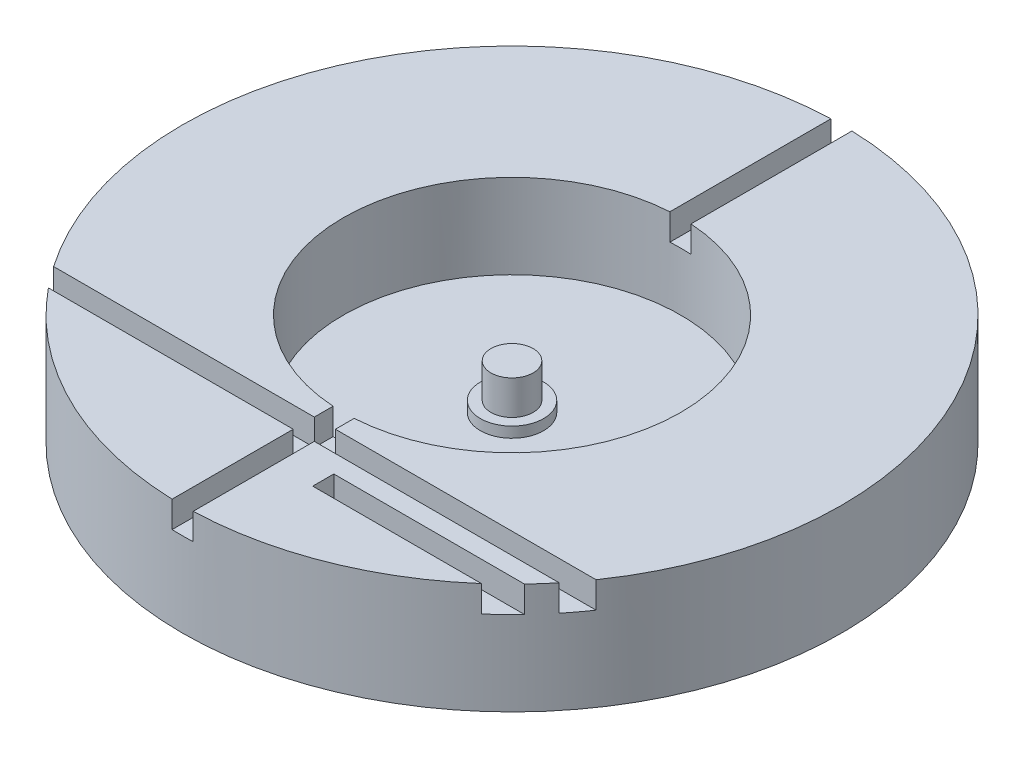
ISO-10303-21;
HEADER;
FILE_DESCRIPTION(('STEP AP214'),'2;1');
FILE_NAME('part.step','',(''),(''),'','','');
FILE_SCHEMA(('AUTOMOTIVE_DESIGN { 1 0 10303 214 1 1 1 1 }'));
ENDSEC;
DATA;
#1=APPLICATION_CONTEXT('core data for automotive mechanical design processes');
#2=APPLICATION_PROTOCOL_DEFINITION('international standard','automotive_design',2000,#1);
#3=PRODUCT_CONTEXT('',#1,'mechanical');
#4=PRODUCT('Part','Part','',(#3));
#5=PRODUCT_RELATED_PRODUCT_CATEGORY('part','',(#4));
#6=PRODUCT_DEFINITION_FORMATION('','',#4);
#7=PRODUCT_DEFINITION_CONTEXT('part definition',#1,'design');
#8=PRODUCT_DEFINITION('design','',#6,#7);
#9=PRODUCT_DEFINITION_SHAPE('','',#8);
#10=(LENGTH_UNIT() NAMED_UNIT(*) SI_UNIT(.MILLI.,.METRE.));
#11=(NAMED_UNIT(*) PLANE_ANGLE_UNIT() SI_UNIT($,.RADIAN.));
#12=(NAMED_UNIT(*) SI_UNIT($,.STERADIAN.) SOLID_ANGLE_UNIT());
#13=UNCERTAINTY_MEASURE_WITH_UNIT(LENGTH_MEASURE(1.E-05),#10,'distance_accuracy_value','');
#14=(GEOMETRIC_REPRESENTATION_CONTEXT(3) GLOBAL_UNCERTAINTY_ASSIGNED_CONTEXT((#13)) GLOBAL_UNIT_ASSIGNED_CONTEXT((#10,
#11,#12)) REPRESENTATION_CONTEXT('',''));
#15=CARTESIAN_POINT('',(0.,0.,0.));
#16=DIRECTION('',(0.,0.,1.));
#17=DIRECTION('',(1.,0.,0.));
#18=AXIS2_PLACEMENT_3D('',#15,#16,#17);
#19=CARTESIAN_POINT('',(0.,21.,0.));
#20=DIRECTION('',(0.,1.,0.));
#21=DIRECTION('',(0.,0.,1.));
#22=AXIS2_PLACEMENT_3D('',#19,#20,#21);
#23=PLANE('',#22);
#24=DIRECTION('',(1.,0.,0.));
#25=VECTOR('',#24,1.);
#26=CARTESIAN_POINT('',(0.,21.,47.));
#27=LINE('',#26,#25);
#28=CARTESIAN_POINT('',(9.19769411022903,21.,47.));
#29=VERTEX_POINT('',#28);
#30=CARTESIAN_POINT('',(41.197694110229,21.,47.));
#31=VERTEX_POINT('',#30);
#32=EDGE_CURVE('E387',#29,#31,#27,.T.);
#33=ORIENTED_EDGE('',*,*,#32,.F.);
#34=DIRECTION('',(0.,0.,1.));
#35=VECTOR('',#34,1.);
#36=CARTESIAN_POINT('',(9.19769411022903,21.,0.));
#37=LINE('',#36,#35);
#38=CARTESIAN_POINT('',(9.19769411022903,21.,43.));
#39=VERTEX_POINT('',#38);
#40=EDGE_CURVE('E384',#39,#29,#37,.T.);
#41=ORIENTED_EDGE('',*,*,#40,.F.);
#42=DIRECTION('',(1.,0.,0.));
#43=VECTOR('',#42,1.);
#44=CARTESIAN_POINT('',(0.,21.,43.));
#45=LINE('',#44,#43);
#46=CARTESIAN_POINT('',(45.3569178847064,21.,43.));
#47=VERTEX_POINT('',#46);
#48=EDGE_CURVE('E373',#39,#47,#45,.T.);
#49=ORIENTED_EDGE('',*,*,#48,.T.);
#50=CARTESIAN_POINT('',(0.,21.,0.));
#51=DIRECTION('',(0.,1.,0.));
#52=DIRECTION('',(0.,0.,1.));
#53=AXIS2_PLACEMENT_3D('',#50,#51,#52);
#54=CIRCLE('',#53,62.5);
#55=CARTESIAN_POINT('',(48.4355241532493,21.,39.5));
#56=VERTEX_POINT('',#55);
#57=EDGE_CURVE('E189',#47,#56,#54,.T.);
#58=ORIENTED_EDGE('',*,*,#57,.T.);
#59=DIRECTION('',(1.,0.,0.));
#60=VECTOR('',#59,1.);
#61=CARTESIAN_POINT('',(-48.4355241532493,21.,39.5));
#62=LINE('',#61,#60);
#63=CARTESIAN_POINT('',(2.,21.,39.5));
#64=VERTEX_POINT('',#63);
#65=EDGE_CURVE('E211',#64,#56,#62,.T.);
#66=ORIENTED_EDGE('',*,*,#65,.F.);
#67=DIRECTION('',(0.,0.,-1.));
#68=VECTOR('',#67,1.);
#69=CARTESIAN_POINT('',(2.,21.,-62.467991803803));
#70=LINE('',#69,#68);
#71=CARTESIAN_POINT('',(2.,21.,62.467991803803));
#72=VERTEX_POINT('',#71);
#73=EDGE_CURVE('E233',#72,#64,#70,.T.);
#74=ORIENTED_EDGE('',*,*,#73,.F.);
#75=EDGE_CURVE('E281',#72,#31,#54,.T.);
#76=ORIENTED_EDGE('',*,*,#75,.T.);
#77=EDGE_LOOP('',(#33,#41,#49,#58,#66,#74,#76));
#78=FACE_BOUND('',#77,.T.);
#79=ADVANCED_FACE('F32',(#78),#23,.T.);
#80=CARTESIAN_POINT('',(-48.4355241532493,21.,39.5));
#81=VERTEX_POINT('',#80);
#82=CARTESIAN_POINT('',(-2.,21.,39.5));
#83=VERTEX_POINT('',#82);
#84=EDGE_CURVE('E201',#81,#83,#62,.T.);
#85=ORIENTED_EDGE('',*,*,#84,.F.);
#86=CARTESIAN_POINT('',(-2.,21.,62.467991803803));
#87=VERTEX_POINT('',#86);
#88=EDGE_CURVE('E288',#81,#87,#54,.T.);
#89=ORIENTED_EDGE('',*,*,#88,.T.);
#90=DIRECTION('',(0.,0.,1.));
#91=VECTOR('',#90,1.);
#92=CARTESIAN_POINT('',(-2.,21.,-62.467991803803));
#93=LINE('',#92,#91);
#94=EDGE_CURVE('E228',#83,#87,#93,.T.);
#95=ORIENTED_EDGE('',*,*,#94,.F.);
#96=EDGE_LOOP('',(#85,#89,#95));
#97=FACE_BOUND('',#96,.T.);
#98=ADVANCED_FACE('F374',(#97),#23,.T.);
#99=CARTESIAN_POINT('',(-2.,16.,-62.467991803803));
#100=DIRECTION('',(-1.,0.,0.));
#101=DIRECTION('',(0.,0.,1.));
#102=AXIS2_PLACEMENT_3D('',#99,#100,#101);
#103=PLANE('',#102);
#104=DIRECTION('',(0.,0.,1.));
#105=VECTOR('',#104,1.);
#106=CARTESIAN_POINT('',(-2.,16.,-62.467991803803));
#107=LINE('',#106,#105);
#108=CARTESIAN_POINT('',(-2.,16.,39.5));
#109=VERTEX_POINT('',#108);
#110=CARTESIAN_POINT('',(-2.,16.,62.467991803803));
#111=VERTEX_POINT('',#110);
#112=EDGE_CURVE('E232',#109,#111,#107,.T.);
#113=ORIENTED_EDGE('',*,*,#112,.F.);
#114=DIRECTION('',(0.,1.,0.));
#115=VECTOR('',#114,1.);
#116=CARTESIAN_POINT('',(-2.,16.,39.5));
#117=LINE('',#116,#115);
#118=EDGE_CURVE('E225',#109,#83,#117,.T.);
#119=ORIENTED_EDGE('',*,*,#118,.T.);
#120=ORIENTED_EDGE('',*,*,#94,.T.);
#121=DIRECTION('',(0.,1.,0.));
#122=VECTOR('',#121,1.);
#123=CARTESIAN_POINT('',(-2.,16.,62.467991803803));
#124=LINE('',#123,#122);
#125=EDGE_CURVE('E258',#111,#87,#124,.T.);
#126=ORIENTED_EDGE('',*,*,#125,.F.);
#127=EDGE_LOOP('',(#113,#119,#120,#126));
#128=FACE_BOUND('',#127,.T.);
#129=ADVANCED_FACE('F353',(#128),#103,.F.);
#130=CARTESIAN_POINT('',(2.,16.,-62.467991803803));
#131=DIRECTION('',(1.,0.,0.));
#132=DIRECTION('',(0.,0.,-1.));
#133=AXIS2_PLACEMENT_3D('',#130,#131,#132);
#134=PLANE('',#133);
#135=ORIENTED_EDGE('',*,*,#73,.T.);
#136=DIRECTION('',(0.,-1.,0.));
#137=VECTOR('',#136,1.);
#138=CARTESIAN_POINT('',(2.,16.,39.5));
#139=LINE('',#138,#137);
#140=CARTESIAN_POINT('',(2.,16.,39.5));
#141=VERTEX_POINT('',#140);
#142=EDGE_CURVE('E11',#64,#141,#139,.T.);
#143=ORIENTED_EDGE('',*,*,#142,.T.);
#144=DIRECTION('',(0.,0.,-1.));
#145=VECTOR('',#144,1.);
#146=CARTESIAN_POINT('',(2.,16.,-62.467991803803));
#147=LINE('',#146,#145);
#148=CARTESIAN_POINT('',(2.,16.,62.467991803803));
#149=VERTEX_POINT('',#148);
#150=EDGE_CURVE('E240',#149,#141,#147,.T.);
#151=ORIENTED_EDGE('',*,*,#150,.F.);
#152=DIRECTION('',(0.,1.,0.));
#153=VECTOR('',#152,1.);
#154=CARTESIAN_POINT('',(2.,16.,62.467991803803));
#155=LINE('',#154,#153);
#156=EDGE_CURVE('E256',#149,#72,#155,.T.);
#157=ORIENTED_EDGE('',*,*,#156,.T.);
#158=EDGE_LOOP('',(#135,#143,#151,#157));
#159=FACE_BOUND('',#158,.T.);
#160=ADVANCED_FACE('F363',(#159),#134,.F.);
#161=DIRECTION('',(-1.,0.,0.));
#162=VECTOR('',#161,1.);
#163=CARTESIAN_POINT('',(-51.4392845984468,21.,35.5));
#164=LINE('',#163,#162);
#165=CARTESIAN_POINT('',(51.4392845984468,21.,35.5));
#166=VERTEX_POINT('',#165);
#167=CARTESIAN_POINT('',(2.,21.,35.5));
#168=VERTEX_POINT('',#167);
#169=EDGE_CURVE('E209',#166,#168,#164,.T.);
#170=ORIENTED_EDGE('',*,*,#169,.F.);
#171=CARTESIAN_POINT('',(2.,21.,-62.467991803803));
#172=VERTEX_POINT('',#171);
#173=EDGE_CURVE('E323',#166,#172,#54,.T.);
#174=ORIENTED_EDGE('',*,*,#173,.T.);
#175=CARTESIAN_POINT('',(2.,21.,-31.9374388453426));
#176=VERTEX_POINT('',#175);
#177=EDGE_CURVE('E247',#176,#172,#70,.T.);
#178=ORIENTED_EDGE('',*,*,#177,.F.);
#179=CARTESIAN_POINT('',(0.,21.,0.));
#180=DIRECTION('',(0.,1.,0.));
#181=DIRECTION('',(0.,0.,1.));
#182=AXIS2_PLACEMENT_3D('',#179,#180,#181);
#183=CIRCLE('',#182,32.);
#184=CARTESIAN_POINT('',(2.,21.,31.9374388453426));
#185=VERTEX_POINT('',#184);
#186=EDGE_CURVE('E278',#185,#176,#183,.T.);
#187=ORIENTED_EDGE('',*,*,#186,.F.);
#188=EDGE_CURVE('E251',#168,#185,#70,.T.);
#189=ORIENTED_EDGE('',*,*,#188,.F.);
#190=EDGE_LOOP('',(#170,#174,#178,#187,#189));
#191=FACE_BOUND('',#190,.T.);
#192=ADVANCED_FACE('F313',(#191),#23,.T.);
#193=CARTESIAN_POINT('',(0.,7.,0.));
#194=DIRECTION('',(0.,1.,0.));
#195=DIRECTION('',(0.,0.,1.));
#196=AXIS2_PLACEMENT_3D('',#193,#194,#195);
#197=CYLINDRICAL_SURFACE('',#196,4.);
#198=CARTESIAN_POINT('',(0.,7.,0.));
#199=DIRECTION('',(0.,1.,0.));
#200=DIRECTION('',(0.,0.,1.));
#201=AXIS2_PLACEMENT_3D('',#198,#199,#200);
#202=CIRCLE('',#201,4.);
#203=CARTESIAN_POINT('',(0.,7.,4.));
#204=VERTEX_POINT('',#203);
#205=EDGE_CURVE('E264',#204,#204,#202,.T.);
#206=CARTESIAN_POINT('',(0.,13.5,0.));
#207=DIRECTION('',(0.,1.,0.));
#208=DIRECTION('',(0.,0.,1.));
#209=AXIS2_PLACEMENT_3D('',#206,#207,#208);
#210=CIRCLE('',#209,4.);
#211=CARTESIAN_POINT('',(0.,13.5,4.));
#212=VERTEX_POINT('',#211);
#213=EDGE_CURVE('E255',#212,#212,#210,.T.);
#214=CARTESIAN_POINT('',(0.,7.,4.));
#215=CARTESIAN_POINT('',(0.,7.06770833333334,4.));
#216=CARTESIAN_POINT('',(0.,7.13541666666667,4.));
#217=CARTESIAN_POINT('',(0.,7.27083333333334,4.));
#218=CARTESIAN_POINT('',(0.,7.33854166666667,4.));
#219=CARTESIAN_POINT('',(0.,7.47395833333334,4.));
#220=CARTESIAN_POINT('',(0.,7.54166666666667,4.));
#221=CARTESIAN_POINT('',(0.,7.67708333333333,4.));
#222=CARTESIAN_POINT('',(0.,7.74479166666667,4.));
#223=CARTESIAN_POINT('',(0.,7.88020833333333,4.));
#224=CARTESIAN_POINT('',(0.,7.94791666666667,4.));
#225=CARTESIAN_POINT('',(0.,8.08333333333333,4.));
#226=CARTESIAN_POINT('',(0.,8.15104166666667,4.));
#227=CARTESIAN_POINT('',(0.,8.28645833333334,4.));
#228=CARTESIAN_POINT('',(0.,8.35416666666667,4.));
#229=CARTESIAN_POINT('',(0.,8.48958333333334,4.));
#230=CARTESIAN_POINT('',(0.,8.55729166666667,4.));
#231=CARTESIAN_POINT('',(0.,8.69270833333334,4.));
#232=CARTESIAN_POINT('',(0.,8.76041666666667,4.));
#233=CARTESIAN_POINT('',(0.,8.89583333333334,4.));
#234=CARTESIAN_POINT('',(0.,8.96354166666667,4.));
#235=CARTESIAN_POINT('',(0.,9.09895833333333,4.));
#236=CARTESIAN_POINT('',(0.,9.16666666666667,4.));
#237=CARTESIAN_POINT('',(0.,9.30208333333333,4.));
#238=CARTESIAN_POINT('',(0.,9.36979166666667,4.));
#239=CARTESIAN_POINT('',(0.,9.50520833333333,4.));
#240=CARTESIAN_POINT('',(0.,9.57291666666667,4.));
#241=CARTESIAN_POINT('',(0.,9.70833333333333,4.));
#242=CARTESIAN_POINT('',(0.,9.77604166666667,4.));
#243=CARTESIAN_POINT('',(0.,9.91145833333333,4.));
#244=CARTESIAN_POINT('',(0.,9.97916666666667,4.));
#245=CARTESIAN_POINT('',(0.,10.1145833333333,4.));
#246=CARTESIAN_POINT('',(0.,10.1822916666667,4.));
#247=CARTESIAN_POINT('',(0.,10.3177083333333,4.));
#248=CARTESIAN_POINT('',(0.,10.3854166666667,4.));
#249=CARTESIAN_POINT('',(0.,10.5208333333333,4.));
#250=CARTESIAN_POINT('',(0.,10.5885416666667,4.));
#251=CARTESIAN_POINT('',(0.,10.7239583333333,4.));
#252=CARTESIAN_POINT('',(0.,10.7916666666667,4.));
#253=CARTESIAN_POINT('',(0.,10.9270833333333,4.));
#254=CARTESIAN_POINT('',(0.,10.9947916666667,4.));
#255=CARTESIAN_POINT('',(0.,11.1302083333333,4.));
#256=CARTESIAN_POINT('',(0.,11.1979166666667,4.));
#257=CARTESIAN_POINT('',(0.,11.3333333333333,4.));
#258=CARTESIAN_POINT('',(0.,11.4010416666667,4.));
#259=CARTESIAN_POINT('',(0.,11.5364583333333,4.));
#260=CARTESIAN_POINT('',(0.,11.6041666666667,4.));
#261=CARTESIAN_POINT('',(0.,11.7395833333333,4.));
#262=CARTESIAN_POINT('',(0.,11.8072916666667,4.));
#263=CARTESIAN_POINT('',(0.,11.9427083333333,4.));
#264=CARTESIAN_POINT('',(0.,12.0104166666667,4.));
#265=CARTESIAN_POINT('',(0.,12.1458333333333,4.));
#266=CARTESIAN_POINT('',(0.,12.2135416666667,4.));
#267=CARTESIAN_POINT('',(0.,12.3489583333333,4.));
#268=CARTESIAN_POINT('',(0.,12.4166666666667,4.));
#269=CARTESIAN_POINT('',(0.,12.5520833333333,4.));
#270=CARTESIAN_POINT('',(0.,12.6197916666667,4.));
#271=CARTESIAN_POINT('',(0.,12.7552083333333,4.));
#272=CARTESIAN_POINT('',(0.,12.8229166666667,4.));
#273=CARTESIAN_POINT('',(0.,12.9583333333333,4.));
#274=CARTESIAN_POINT('',(0.,13.0260416666667,4.));
#275=CARTESIAN_POINT('',(0.,13.1614583333333,4.));
#276=CARTESIAN_POINT('',(0.,13.2291666666667,4.));
#277=CARTESIAN_POINT('',(0.,13.3645833333333,4.));
#278=CARTESIAN_POINT('',(0.,13.4322916666667,4.));
#279=CARTESIAN_POINT('',(0.,13.5,4.));
#280=B_SPLINE_CURVE_WITH_KNOTS('',3,(#214,#215,#216,#217,#218,#219,#220,#221,#222,#223,#224,
#225,#226,#227,#228,#229,#230,#231,#232,#233,#234,#235,#236,#237,#238,#239,#240,#241,#242,#243,
#244,#245,#246,#247,#248,#249,#250,#251,#252,#253,#254,#255,#256,#257,#258,#259,#260,#261,#262,
#263,#264,#265,#266,#267,#268,#269,#270,#271,#272,#273,#274,#275,#276,#277,#278,#279),
.UNSPECIFIED.,.F.,.F.,(4,2,2,2,2,2,2,2,2,2,2,2,2,2,2,2,2,2,2,2,2,2,2,2,2,2,2,2,2,2,2,2,4),(0.,
0.203124999999999,0.40625,0.609375,0.812499999999999,1.015625,1.21875,1.421875,1.625,1.828125,
2.03125,2.234375,2.4375,2.640625,2.84375,3.046875,3.25,3.453125,3.65625,3.859375,4.0625,
4.265625,4.46875,4.671875,4.875,5.078125,5.28125,5.484375,5.6875,5.890625,6.09375,6.296875,6.5),.UNSPECIFIED.);
#281=EDGE_CURVE('BSEAM419',#204,#212,#280,.T.);
#282=ORIENTED_EDGE('',*,*,#205,.T.);
#283=ORIENTED_EDGE('',*,*,#213,.F.);
#284=ORIENTED_EDGE('',*,*,#281,.T.);
#285=ORIENTED_EDGE('',*,*,#281,.F.);
#286=EDGE_LOOP('',(#282,#284,#283,#285));
#287=FACE_BOUND('',#286,.T.);
#288=ADVANCED_FACE('F419',(#287),#197,.T.);
#289=CARTESIAN_POINT('',(0.,5.,0.));
#290=DIRECTION('',(0.,1.,0.));
#291=DIRECTION('',(0.,0.,1.));
#292=AXIS2_PLACEMENT_3D('',#289,#290,#291);
#293=CYLINDRICAL_SURFACE('',#292,6.);
#294=CARTESIAN_POINT('',(0.,5.,0.));
#295=DIRECTION('',(0.,1.,0.));
#296=DIRECTION('',(0.,0.,1.));
#297=AXIS2_PLACEMENT_3D('',#294,#295,#296);
#298=CIRCLE('',#297,6.);
#299=CARTESIAN_POINT('',(0.,5.,6.));
#300=VERTEX_POINT('',#299);
#301=EDGE_CURVE('E270',#300,#300,#298,.T.);
#302=ORIENTED_EDGE('',*,*,#301,.T.);
#303=EDGE_LOOP('',(#302));
#304=FACE_BOUND('',#303,.T.);
#305=CARTESIAN_POINT('',(0.,7.,0.));
#306=DIRECTION('',(0.,1.,0.));
#307=DIRECTION('',(0.,0.,1.));
#308=AXIS2_PLACEMENT_3D('',#305,#306,#307);
#309=CIRCLE('',#308,6.);
#310=CARTESIAN_POINT('',(0.,7.,6.));
#311=VERTEX_POINT('',#310);
#312=EDGE_CURVE('E267',#311,#311,#309,.T.);
#313=ORIENTED_EDGE('',*,*,#312,.F.);
#314=EDGE_LOOP('',(#313));
#315=FACE_BOUND('',#314,.T.);
#316=ADVANCED_FACE('F417',(#304,#315),#293,.T.);
#317=CARTESIAN_POINT('',(0.,21.,0.));
#318=DIRECTION('',(0.,-1.,0.));
#319=DIRECTION('',(0.,0.,-1.));
#320=AXIS2_PLACEMENT_3D('',#317,#318,#319);
#321=CYLINDRICAL_SURFACE('',#320,62.5);
#322=CARTESIAN_POINT('',(0.,16.,0.));
#323=DIRECTION('',(0.,1.,0.));
#324=DIRECTION('',(0.,0.,1.));
#325=AXIS2_PLACEMENT_3D('',#322,#323,#324);
#326=CIRCLE('',#325,62.5);
#327=CARTESIAN_POINT('',(41.197694110229,16.,47.));
#328=VERTEX_POINT('',#327);
#329=CARTESIAN_POINT('',(45.3569178847064,16.,43.));
#330=VERTEX_POINT('',#329);
#331=EDGE_CURVE('E179',#328,#330,#326,.T.);
#332=ORIENTED_EDGE('',*,*,#331,.F.);
#333=DIRECTION('',(0.,1.,0.));
#334=VECTOR('',#333,1.);
#335=CARTESIAN_POINT('',(41.197694110229,16.,47.));
#336=LINE('',#335,#334);
#337=EDGE_CURVE('E190',#328,#31,#336,.T.);
#338=ORIENTED_EDGE('',*,*,#337,.T.);
#339=ORIENTED_EDGE('',*,*,#75,.F.);
#340=ORIENTED_EDGE('',*,*,#156,.F.);
#341=CARTESIAN_POINT('',(0.,16.,0.));
#342=DIRECTION('',(0.,1.,0.));
#343=DIRECTION('',(0.,0.,1.));
#344=AXIS2_PLACEMENT_3D('',#341,#342,#343);
#345=CIRCLE('',#344,62.5);
#346=EDGE_CURVE('E236',#111,#149,#345,.T.);
#347=ORIENTED_EDGE('',*,*,#346,.F.);
#348=ORIENTED_EDGE('',*,*,#125,.T.);
#349=ORIENTED_EDGE('',*,*,#88,.F.);
#350=DIRECTION('',(0.,1.,0.));
#351=VECTOR('',#350,1.);
#352=CARTESIAN_POINT('',(-48.4355241532493,16.,39.5));
#353=LINE('',#352,#351);
#354=CARTESIAN_POINT('',(-48.4355241532493,16.,39.5));
#355=VERTEX_POINT('',#354);
#356=EDGE_CURVE('E217',#355,#81,#353,.T.);
#357=ORIENTED_EDGE('',*,*,#356,.F.);
#358=CARTESIAN_POINT('',(0.,16.,0.));
#359=DIRECTION('',(0.,1.,0.));
#360=DIRECTION('',(0.,0.,1.));
#361=AXIS2_PLACEMENT_3D('',#358,#359,#360);
#362=CIRCLE('',#361,62.5);
#363=CARTESIAN_POINT('',(-51.4392845984468,16.,35.5));
#364=VERTEX_POINT('',#363);
#365=EDGE_CURVE('E204',#364,#355,#362,.T.);
#366=ORIENTED_EDGE('',*,*,#365,.F.);
#367=DIRECTION('',(0.,1.,0.));
#368=VECTOR('',#367,1.);
#369=CARTESIAN_POINT('',(-51.4392845984468,16.,35.5));
#370=LINE('',#369,#368);
#371=CARTESIAN_POINT('',(-51.4392845984468,21.,35.5));
#372=VERTEX_POINT('',#371);
#373=EDGE_CURVE('E219',#364,#372,#370,.T.);
#374=ORIENTED_EDGE('',*,*,#373,.T.);
#375=CARTESIAN_POINT('',(-2.,21.,-62.467991803803));
#376=VERTEX_POINT('',#375);
#377=EDGE_CURVE('E285',#376,#372,#54,.T.);
#378=ORIENTED_EDGE('',*,*,#377,.F.);
#379=DIRECTION('',(0.,1.,0.));
#380=VECTOR('',#379,1.);
#381=CARTESIAN_POINT('',(-2.,16.,-62.467991803803));
#382=LINE('',#381,#380);
#383=CARTESIAN_POINT('',(-2.,16.,-62.467991803803));
#384=VERTEX_POINT('',#383);
#385=EDGE_CURVE('E243',#384,#376,#382,.T.);
#386=ORIENTED_EDGE('',*,*,#385,.F.);
#387=CARTESIAN_POINT('',(0.,16.,0.));
#388=DIRECTION('',(0.,1.,0.));
#389=DIRECTION('',(0.,0.,1.));
#390=AXIS2_PLACEMENT_3D('',#387,#388,#389);
#391=CIRCLE('',#390,62.5);
#392=CARTESIAN_POINT('',(2.,16.,-62.467991803803));
#393=VERTEX_POINT('',#392);
#394=EDGE_CURVE('E229',#393,#384,#391,.T.);
#395=ORIENTED_EDGE('',*,*,#394,.F.);
#396=DIRECTION('',(0.,1.,0.));
#397=VECTOR('',#396,1.);
#398=CARTESIAN_POINT('',(2.,16.,-62.467991803803));
#399=LINE('',#398,#397);
#400=EDGE_CURVE('E252',#393,#172,#399,.T.);
#401=ORIENTED_EDGE('',*,*,#400,.T.);
#402=ORIENTED_EDGE('',*,*,#173,.F.);
#403=DIRECTION('',(0.,1.,0.));
#404=VECTOR('',#403,1.);
#405=CARTESIAN_POINT('',(51.4392845984468,16.,35.5));
#406=LINE('',#405,#404);
#407=CARTESIAN_POINT('',(51.4392845984468,16.,35.5));
#408=VERTEX_POINT('',#407);
#409=EDGE_CURVE('E208',#408,#166,#406,.T.);
#410=ORIENTED_EDGE('',*,*,#409,.F.);
#411=CARTESIAN_POINT('',(0.,16.,0.));
#412=DIRECTION('',(0.,1.,0.));
#413=DIRECTION('',(0.,0.,1.));
#414=AXIS2_PLACEMENT_3D('',#411,#412,#413);
#415=CIRCLE('',#414,62.5);
#416=CARTESIAN_POINT('',(48.4355241532493,16.,39.5));
#417=VERTEX_POINT('',#416);
#418=EDGE_CURVE('E197',#417,#408,#415,.T.);
#419=ORIENTED_EDGE('',*,*,#418,.F.);
#420=DIRECTION('',(0.,1.,0.));
#421=VECTOR('',#420,1.);
#422=CARTESIAN_POINT('',(48.4355241532493,16.,39.5));
#423=LINE('',#422,#421);
#424=EDGE_CURVE('E214',#417,#56,#423,.T.);
#425=ORIENTED_EDGE('',*,*,#424,.T.);
#426=ORIENTED_EDGE('',*,*,#57,.F.);
#427=DIRECTION('',(0.,1.,0.));
#428=VECTOR('',#427,1.);
#429=CARTESIAN_POINT('',(45.3569178847064,16.,43.));
#430=LINE('',#429,#428);
#431=EDGE_CURVE('E174',#330,#47,#430,.T.);
#432=ORIENTED_EDGE('',*,*,#431,.F.);
#433=EDGE_LOOP('',(#332,#338,#339,#340,#347,#348,#349,#357,#366,#374,#378,#386,#395,#401,#402,
#410,#419,#425,#426,#432));
#434=FACE_BOUND('',#433,.T.);
#435=CARTESIAN_POINT('',(0.,0.,0.));
#436=DIRECTION('',(0.,1.,0.));
#437=DIRECTION('',(0.,0.,1.));
#438=AXIS2_PLACEMENT_3D('',#435,#436,#437);
#439=CIRCLE('',#438,62.5);
#440=CARTESIAN_POINT('',(0.,0.,62.5));
#441=VERTEX_POINT('',#440);
#442=EDGE_CURVE('E277',#441,#441,#439,.T.);
#443=ORIENTED_EDGE('',*,*,#442,.T.);
#444=EDGE_LOOP('',(#443));
#445=FACE_BOUND('',#444,.T.);
#446=ADVANCED_FACE('F34',(#434,#445),#321,.T.);
#447=CARTESIAN_POINT('',(-2.,21.,35.5));
#448=VERTEX_POINT('',#447);
#449=EDGE_CURVE('E212',#448,#372,#164,.T.);
#450=ORIENTED_EDGE('',*,*,#449,.F.);
#451=CARTESIAN_POINT('',(-2.,21.,31.9374388453426));
#452=VERTEX_POINT('',#451);
#453=EDGE_CURVE('E248',#452,#448,#93,.T.);
#454=ORIENTED_EDGE('',*,*,#453,.F.);
#455=CARTESIAN_POINT('',(-2.,21.,-31.9374388453426));
#456=VERTEX_POINT('',#455);
#457=EDGE_CURVE('E273',#456,#452,#183,.T.);
#458=ORIENTED_EDGE('',*,*,#457,.F.);
#459=EDGE_CURVE('E245',#376,#456,#93,.T.);
#460=ORIENTED_EDGE('',*,*,#459,.F.);
#461=ORIENTED_EDGE('',*,*,#377,.T.);
#462=EDGE_LOOP('',(#450,#454,#458,#460,#461));
#463=FACE_BOUND('',#462,.T.);
#464=ADVANCED_FACE('F345',(#463),#23,.T.);
#465=CARTESIAN_POINT('',(0.,0.,0.));
#466=DIRECTION('',(0.,1.,0.));
#467=DIRECTION('',(0.,0.,1.));
#468=AXIS2_PLACEMENT_3D('',#465,#466,#467);
#469=PLANE('',#468);
#470=ORIENTED_EDGE('',*,*,#442,.F.);
#471=EDGE_LOOP('',(#470));
#472=FACE_BOUND('',#471,.T.);
#473=ADVANCED_FACE('F411',(#472),#469,.F.);
#474=CARTESIAN_POINT('',(0.,5.,0.));
#475=DIRECTION('',(0.,1.,0.));
#476=DIRECTION('',(0.,0.,1.));
#477=AXIS2_PLACEMENT_3D('',#474,#475,#476);
#478=CYLINDRICAL_SURFACE('',#477,32.);
#479=ORIENTED_EDGE('',*,*,#186,.T.);
#480=DIRECTION('',(0.,1.,0.));
#481=VECTOR('',#480,1.);
#482=CARTESIAN_POINT('',(2.,5.,-31.9374388453426));
#483=LINE('',#482,#481);
#484=CARTESIAN_POINT('',(2.,16.,-31.9374388453426));
#485=VERTEX_POINT('',#484);
#486=EDGE_CURVE('E300',#176,#485,#483,.F.);
#487=ORIENTED_EDGE('',*,*,#486,.T.);
#488=CARTESIAN_POINT('',(0.,16.,0.));
#489=DIRECTION('',(0.,1.,0.));
#490=DIRECTION('',(0.,0.,1.));
#491=AXIS2_PLACEMENT_3D('',#488,#489,#490);
#492=CIRCLE('',#491,32.);
#493=CARTESIAN_POINT('',(-2.,16.,-31.9374388453426));
#494=VERTEX_POINT('',#493);
#495=EDGE_CURVE('E291',#494,#485,#492,.F.);
#496=ORIENTED_EDGE('',*,*,#495,.F.);
#497=DIRECTION('',(0.,1.,0.));
#498=VECTOR('',#497,1.);
#499=CARTESIAN_POINT('',(-2.,5.,-31.9374388453426));
#500=LINE('',#499,#498);
#501=EDGE_CURVE('E297',#494,#456,#500,.T.);
#502=ORIENTED_EDGE('',*,*,#501,.T.);
#503=ORIENTED_EDGE('',*,*,#457,.T.);
#504=DIRECTION('',(0.,1.,0.));
#505=VECTOR('',#504,1.);
#506=CARTESIAN_POINT('',(-2.,5.,31.9374388453426));
#507=LINE('',#506,#505);
#508=CARTESIAN_POINT('',(-2.,16.,31.9374388453426));
#509=VERTEX_POINT('',#508);
#510=EDGE_CURVE('E290',#452,#509,#507,.F.);
#511=ORIENTED_EDGE('',*,*,#510,.T.);
#512=CARTESIAN_POINT('',(2.,16.,31.9374388453426));
#513=VERTEX_POINT('',#512);
#514=EDGE_CURVE('E284',#513,#509,#492,.F.);
#515=ORIENTED_EDGE('',*,*,#514,.F.);
#516=DIRECTION('',(0.,1.,0.));
#517=VECTOR('',#516,1.);
#518=CARTESIAN_POINT('',(2.,5.,31.9374388453426));
#519=LINE('',#518,#517);
#520=EDGE_CURVE('E294',#513,#185,#519,.T.);
#521=ORIENTED_EDGE('',*,*,#520,.T.);
#522=EDGE_LOOP('',(#479,#487,#496,#502,#503,#511,#515,#521));
#523=FACE_BOUND('',#522,.T.);
#524=CARTESIAN_POINT('',(0.,5.,0.));
#525=DIRECTION('',(0.,1.,0.));
#526=DIRECTION('',(0.,0.,1.));
#527=AXIS2_PLACEMENT_3D('',#524,#525,#526);
#528=CIRCLE('',#527,32.);
#529=CARTESIAN_POINT('',(0.,5.,32.));
#530=VERTEX_POINT('',#529);
#531=EDGE_CURVE('E274',#530,#530,#528,.T.);
#532=ORIENTED_EDGE('',*,*,#531,.F.);
#533=EDGE_LOOP('',(#532));
#534=FACE_BOUND('',#533,.T.);
#535=ADVANCED_FACE('F335',(#523,#534),#478,.F.);
#536=CARTESIAN_POINT('',(0.,5.,0.));
#537=DIRECTION('',(0.,1.,0.));
#538=DIRECTION('',(0.,0.,1.));
#539=AXIS2_PLACEMENT_3D('',#536,#537,#538);
#540=PLANE('',#539);
#541=ORIENTED_EDGE('',*,*,#301,.F.);
#542=EDGE_LOOP('',(#541));
#543=FACE_BOUND('',#542,.T.);
#544=ORIENTED_EDGE('',*,*,#531,.T.);
#545=EDGE_LOOP('',(#544));
#546=FACE_BOUND('',#545,.T.);
#547=ADVANCED_FACE('F527',(#543,#546),#540,.T.);
#548=CARTESIAN_POINT('',(0.,7.,0.));
#549=DIRECTION('',(0.,1.,0.));
#550=DIRECTION('',(0.,0.,1.));
#551=AXIS2_PLACEMENT_3D('',#548,#549,#550);
#552=PLANE('',#551);
#553=ORIENTED_EDGE('',*,*,#205,.F.);
#554=EDGE_LOOP('',(#553));
#555=FACE_BOUND('',#554,.T.);
#556=ORIENTED_EDGE('',*,*,#312,.T.);
#557=EDGE_LOOP('',(#556));
#558=FACE_BOUND('',#557,.T.);
#559=ADVANCED_FACE('F451',(#555,#558),#552,.T.);
#560=CARTESIAN_POINT('',(0.,13.5,0.));
#561=DIRECTION('',(0.,1.,0.));
#562=DIRECTION('',(0.,0.,1.));
#563=AXIS2_PLACEMENT_3D('',#560,#561,#562);
#564=PLANE('',#563);
#565=ORIENTED_EDGE('',*,*,#213,.T.);
#566=EDGE_LOOP('',(#565));
#567=FACE_BOUND('',#566,.T.);
#568=ADVANCED_FACE('F447',(#567),#564,.T.);
#569=CARTESIAN_POINT('',(0.,16.,0.));
#570=DIRECTION('',(0.,1.,0.));
#571=DIRECTION('',(0.,0.,1.));
#572=AXIS2_PLACEMENT_3D('',#569,#570,#571);
#573=PLANE('',#572);
#574=CARTESIAN_POINT('',(-2.,16.,35.5));
#575=VERTEX_POINT('',#574);
#576=EDGE_CURVE('E237',#509,#575,#107,.T.);
#577=ORIENTED_EDGE('',*,*,#576,.T.);
#578=DIRECTION('',(-1.,0.,0.));
#579=VECTOR('',#578,1.);
#580=CARTESIAN_POINT('',(-51.4392845984468,16.,35.5));
#581=LINE('',#580,#579);
#582=EDGE_CURVE('E200',#575,#364,#581,.T.);
#583=ORIENTED_EDGE('',*,*,#582,.T.);
#584=ORIENTED_EDGE('',*,*,#365,.T.);
#585=DIRECTION('',(1.,0.,0.));
#586=VECTOR('',#585,1.);
#587=CARTESIAN_POINT('',(-48.4355241532493,16.,39.5));
#588=LINE('',#587,#586);
#589=EDGE_CURVE('E55',#355,#109,#588,.T.);
#590=ORIENTED_EDGE('',*,*,#589,.T.);
#591=ORIENTED_EDGE('',*,*,#112,.T.);
#592=ORIENTED_EDGE('',*,*,#346,.T.);
#593=ORIENTED_EDGE('',*,*,#150,.T.);
#594=EDGE_CURVE('E206',#141,#417,#588,.T.);
#595=ORIENTED_EDGE('',*,*,#594,.T.);
#596=ORIENTED_EDGE('',*,*,#418,.T.);
#597=CARTESIAN_POINT('',(2.,16.,35.5));
#598=VERTEX_POINT('',#597);
#599=EDGE_CURVE('E202',#408,#598,#581,.T.);
#600=ORIENTED_EDGE('',*,*,#599,.T.);
#601=EDGE_CURVE('E244',#598,#513,#147,.T.);
#602=ORIENTED_EDGE('',*,*,#601,.T.);
#603=ORIENTED_EDGE('',*,*,#514,.T.);
#604=EDGE_LOOP('',(#577,#583,#584,#590,#591,#592,#593,#595,#596,#600,#602,#603));
#605=FACE_BOUND('',#604,.T.);
#606=ADVANCED_FACE('F331',(#605),#573,.T.);
#607=ORIENTED_EDGE('',*,*,#453,.T.);
#608=DIRECTION('',(0.,-1.,0.));
#609=VECTOR('',#608,1.);
#610=CARTESIAN_POINT('',(-2.,16.,35.5));
#611=LINE('',#610,#609);
#612=EDGE_CURVE('E216',#448,#575,#611,.T.);
#613=ORIENTED_EDGE('',*,*,#612,.T.);
#614=ORIENTED_EDGE('',*,*,#576,.F.);
#615=ORIENTED_EDGE('',*,*,#510,.F.);
#616=EDGE_LOOP('',(#607,#613,#614,#615));
#617=FACE_BOUND('',#616,.T.);
#618=ADVANCED_FACE('F342',(#617),#103,.F.);
#619=ORIENTED_EDGE('',*,*,#601,.F.);
#620=DIRECTION('',(0.,1.,0.));
#621=VECTOR('',#620,1.);
#622=CARTESIAN_POINT('',(2.,16.,35.5));
#623=LINE('',#622,#621);
#624=EDGE_CURVE('E40',#598,#168,#623,.T.);
#625=ORIENTED_EDGE('',*,*,#624,.T.);
#626=ORIENTED_EDGE('',*,*,#188,.T.);
#627=ORIENTED_EDGE('',*,*,#520,.F.);
#628=EDGE_LOOP('',(#619,#625,#626,#627));
#629=FACE_BOUND('',#628,.T.);
#630=ADVANCED_FACE('F307',(#629),#134,.F.);
#631=ORIENTED_EDGE('',*,*,#177,.T.);
#632=ORIENTED_EDGE('',*,*,#400,.F.);
#633=EDGE_CURVE('E239',#485,#393,#147,.T.);
#634=ORIENTED_EDGE('',*,*,#633,.F.);
#635=ORIENTED_EDGE('',*,*,#486,.F.);
#636=EDGE_LOOP('',(#631,#632,#634,#635));
#637=FACE_BOUND('',#636,.T.);
#638=ADVANCED_FACE('F319',(#637),#134,.F.);
#639=EDGE_CURVE('E234',#384,#494,#107,.T.);
#640=ORIENTED_EDGE('',*,*,#639,.F.);
#641=ORIENTED_EDGE('',*,*,#385,.T.);
#642=ORIENTED_EDGE('',*,*,#459,.T.);
#643=ORIENTED_EDGE('',*,*,#501,.F.);
#644=EDGE_LOOP('',(#640,#641,#642,#643));
#645=FACE_BOUND('',#644,.T.);
#646=ADVANCED_FACE('F431',(#645),#103,.F.);
#647=ORIENTED_EDGE('',*,*,#495,.T.);
#648=ORIENTED_EDGE('',*,*,#633,.T.);
#649=ORIENTED_EDGE('',*,*,#394,.T.);
#650=ORIENTED_EDGE('',*,*,#639,.T.);
#651=EDGE_LOOP('',(#647,#648,#649,#650));
#652=FACE_BOUND('',#651,.T.);
#653=ADVANCED_FACE('F327',(#652),#573,.T.);
#654=CARTESIAN_POINT('',(-51.4392845984468,16.,35.5));
#655=DIRECTION('',(0.,0.,-1.));
#656=DIRECTION('',(-1.,0.,0.));
#657=AXIS2_PLACEMENT_3D('',#654,#655,#656);
#658=PLANE('',#657);
#659=ORIENTED_EDGE('',*,*,#599,.F.);
#660=ORIENTED_EDGE('',*,*,#409,.T.);
#661=ORIENTED_EDGE('',*,*,#169,.T.);
#662=ORIENTED_EDGE('',*,*,#624,.F.);
#663=EDGE_LOOP('',(#659,#660,#661,#662));
#664=FACE_BOUND('',#663,.T.);
#665=ADVANCED_FACE('F401',(#664),#658,.F.);
#666=CARTESIAN_POINT('',(-48.4355241532493,16.,39.5));
#667=DIRECTION('',(0.,0.,1.));
#668=DIRECTION('',(1.,0.,0.));
#669=AXIS2_PLACEMENT_3D('',#666,#667,#668);
#670=PLANE('',#669);
#671=ORIENTED_EDGE('',*,*,#65,.T.);
#672=ORIENTED_EDGE('',*,*,#424,.F.);
#673=ORIENTED_EDGE('',*,*,#594,.F.);
#674=ORIENTED_EDGE('',*,*,#142,.F.);
#675=EDGE_LOOP('',(#671,#672,#673,#674));
#676=FACE_BOUND('',#675,.T.);
#677=ADVANCED_FACE('F368',(#676),#670,.F.);
#678=ORIENTED_EDGE('',*,*,#589,.F.);
#679=ORIENTED_EDGE('',*,*,#356,.T.);
#680=ORIENTED_EDGE('',*,*,#84,.T.);
#681=ORIENTED_EDGE('',*,*,#118,.F.);
#682=EDGE_LOOP('',(#678,#679,#680,#681));
#683=FACE_BOUND('',#682,.T.);
#684=ADVANCED_FACE('F376',(#683),#670,.F.);
#685=ORIENTED_EDGE('',*,*,#449,.T.);
#686=ORIENTED_EDGE('',*,*,#373,.F.);
#687=ORIENTED_EDGE('',*,*,#582,.F.);
#688=ORIENTED_EDGE('',*,*,#612,.F.);
#689=EDGE_LOOP('',(#685,#686,#687,#688));
#690=FACE_BOUND('',#689,.T.);
#691=ADVANCED_FACE('F380',(#690),#658,.F.);
#692=CARTESIAN_POINT('',(0.,16.,47.));
#693=DIRECTION('',(0.,0.,1.));
#694=DIRECTION('',(1.,0.,0.));
#695=AXIS2_PLACEMENT_3D('',#692,#693,#694);
#696=PLANE('',#695);
#697=ORIENTED_EDGE('',*,*,#32,.T.);
#698=ORIENTED_EDGE('',*,*,#337,.F.);
#699=DIRECTION('',(1.,0.,0.));
#700=VECTOR('',#699,1.);
#701=CARTESIAN_POINT('',(0.,16.,47.));
#702=LINE('',#701,#700);
#703=CARTESIAN_POINT('',(9.19769411022903,16.,47.));
#704=VERTEX_POINT('',#703);
#705=EDGE_CURVE('E47',#704,#328,#702,.T.);
#706=ORIENTED_EDGE('',*,*,#705,.F.);
#707=DIRECTION('',(0.,1.,0.));
#708=VECTOR('',#707,1.);
#709=CARTESIAN_POINT('',(9.19769411022903,16.,47.));
#710=LINE('',#709,#708);
#711=EDGE_CURVE('E192',#704,#29,#710,.T.);
#712=ORIENTED_EDGE('',*,*,#711,.T.);
#713=EDGE_LOOP('',(#697,#698,#706,#712));
#714=FACE_BOUND('',#713,.T.);
#715=ADVANCED_FACE('F392',(#714),#696,.F.);
#716=CARTESIAN_POINT('',(9.19769411022903,16.,0.));
#717=DIRECTION('',(-1.,0.,0.));
#718=DIRECTION('',(0.,0.,1.));
#719=AXIS2_PLACEMENT_3D('',#716,#717,#718);
#720=PLANE('',#719);
#721=ORIENTED_EDGE('',*,*,#40,.T.);
#722=ORIENTED_EDGE('',*,*,#711,.F.);
#723=DIRECTION('',(0.,0.,1.));
#724=VECTOR('',#723,1.);
#725=CARTESIAN_POINT('',(9.19769411022903,16.,0.));
#726=LINE('',#725,#724);
#727=CARTESIAN_POINT('',(9.19769411022903,16.,43.));
#728=VERTEX_POINT('',#727);
#729=EDGE_CURVE('E178',#728,#704,#726,.T.);
#730=ORIENTED_EDGE('',*,*,#729,.F.);
#731=DIRECTION('',(0.,1.,0.));
#732=VECTOR('',#731,1.);
#733=CARTESIAN_POINT('',(9.19769411022903,16.,43.));
#734=LINE('',#733,#732);
#735=EDGE_CURVE('E176',#728,#39,#734,.T.);
#736=ORIENTED_EDGE('',*,*,#735,.T.);
#737=EDGE_LOOP('',(#721,#722,#730,#736));
#738=FACE_BOUND('',#737,.T.);
#739=ADVANCED_FACE('F391',(#738),#720,.F.);
#740=CARTESIAN_POINT('',(0.,16.,43.));
#741=DIRECTION('',(0.,0.,1.));
#742=DIRECTION('',(1.,0.,0.));
#743=AXIS2_PLACEMENT_3D('',#740,#741,#742);
#744=PLANE('',#743);
#745=ORIENTED_EDGE('',*,*,#48,.F.);
#746=ORIENTED_EDGE('',*,*,#735,.F.);
#747=DIRECTION('',(1.,0.,0.));
#748=VECTOR('',#747,1.);
#749=CARTESIAN_POINT('',(0.,16.,43.));
#750=LINE('',#749,#748);
#751=EDGE_CURVE('E170',#728,#330,#750,.T.);
#752=ORIENTED_EDGE('',*,*,#751,.T.);
#753=ORIENTED_EDGE('',*,*,#431,.T.);
#754=EDGE_LOOP('',(#745,#746,#752,#753));
#755=FACE_BOUND('',#754,.T.);
#756=ADVANCED_FACE('F172',(#755),#744,.T.);
#757=CARTESIAN_POINT('',(0.,16.,0.));
#758=DIRECTION('',(0.,1.,0.));
#759=DIRECTION('',(0.,0.,1.));
#760=AXIS2_PLACEMENT_3D('',#757,#758,#759);
#761=PLANE('',#760);
#762=ORIENTED_EDGE('',*,*,#705,.T.);
#763=ORIENTED_EDGE('',*,*,#331,.T.);
#764=ORIENTED_EDGE('',*,*,#751,.F.);
#765=ORIENTED_EDGE('',*,*,#729,.T.);
#766=EDGE_LOOP('',(#762,#763,#764,#765));
#767=FACE_BOUND('',#766,.T.);
#768=ADVANCED_FACE('F182',(#767),#761,.T.);
#769=CLOSED_SHELL('',(#79,#98,#129,#160,#192,#288,#316,#446,#464,#473,#535,#547,#559,#568,#606,
#618,#630,#638,#646,#653,#665,#677,#684,#691,#715,#739,#756,#768));
#770=MANIFOLD_SOLID_BREP('B2',#769);
#771=ADVANCED_BREP_SHAPE_REPRESENTATION('',(#18,#770),#14);
#772=SHAPE_DEFINITION_REPRESENTATION(#9,#771);
ENDSEC;
END-ISO-10303-21;
